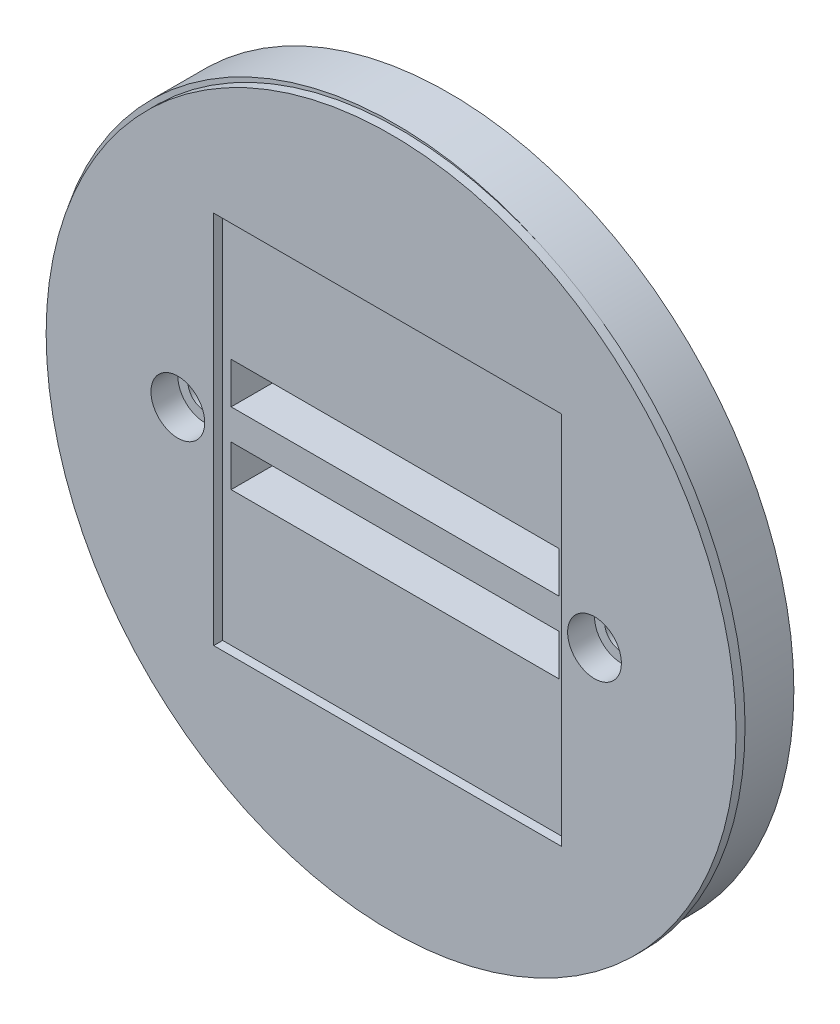
ISO-10303-21;
HEADER;
FILE_DESCRIPTION(('STEP AP214'),'2;1');
FILE_NAME('part.step','',(''),(''),'','','');
FILE_SCHEMA(('AUTOMOTIVE_DESIGN { 1 0 10303 214 1 1 1 1 }'));
ENDSEC;
DATA;
#1=APPLICATION_CONTEXT('core data for automotive mechanical design processes');
#2=APPLICATION_PROTOCOL_DEFINITION('international standard','automotive_design',2000,#1);
#3=PRODUCT_CONTEXT('',#1,'mechanical');
#4=PRODUCT('Part','Part','',(#3));
#5=PRODUCT_RELATED_PRODUCT_CATEGORY('part','',(#4));
#6=PRODUCT_DEFINITION_FORMATION('','',#4);
#7=PRODUCT_DEFINITION_CONTEXT('part definition',#1,'design');
#8=PRODUCT_DEFINITION('design','',#6,#7);
#9=PRODUCT_DEFINITION_SHAPE('','',#8);
#10=(LENGTH_UNIT() NAMED_UNIT(*) SI_UNIT(.MILLI.,.METRE.));
#11=(NAMED_UNIT(*) PLANE_ANGLE_UNIT() SI_UNIT($,.RADIAN.));
#12=(NAMED_UNIT(*) SI_UNIT($,.STERADIAN.) SOLID_ANGLE_UNIT());
#13=UNCERTAINTY_MEASURE_WITH_UNIT(LENGTH_MEASURE(1.E-05),#10,'distance_accuracy_value','');
#14=(GEOMETRIC_REPRESENTATION_CONTEXT(3) GLOBAL_UNCERTAINTY_ASSIGNED_CONTEXT((#13)) GLOBAL_UNIT_ASSIGNED_CONTEXT((#10,
#11,#12)) REPRESENTATION_CONTEXT('',''));
#15=CARTESIAN_POINT('',(0.,0.,0.));
#16=DIRECTION('',(0.,0.,1.));
#17=DIRECTION('',(1.,0.,0.));
#18=AXIS2_PLACEMENT_3D('',#15,#16,#17);
#19=CARTESIAN_POINT('',(23.25,0.,-6.));
#20=DIRECTION('',(0.,0.,1.));
#21=DIRECTION('',(1.,0.,0.));
#22=AXIS2_PLACEMENT_3D('',#19,#20,#21);
#23=CYLINDRICAL_SURFACE('',#22,1.875);
#24=CARTESIAN_POINT('',(23.25,0.,-6.));
#25=DIRECTION('',(0.,0.,1.));
#26=DIRECTION('',(-1.,0.,0.));
#27=AXIS2_PLACEMENT_3D('',#24,#25,#26);
#28=CIRCLE('',#27,1.875);
#29=CARTESIAN_POINT('',(21.375,0.,-6.));
#30=VERTEX_POINT('',#29);
#31=EDGE_CURVE('E175',#30,#30,#28,.T.);
#32=ORIENTED_EDGE('',*,*,#31,.F.);
#33=EDGE_LOOP('',(#32));
#34=FACE_BOUND('',#33,.T.);
#35=CARTESIAN_POINT('',(23.25,0.,-2.));
#36=DIRECTION('',(0.,0.,1.));
#37=DIRECTION('',(1.,0.,0.));
#38=AXIS2_PLACEMENT_3D('',#35,#36,#37);
#39=CIRCLE('',#38,1.875);
#40=CARTESIAN_POINT('',(25.125,0.,-2.));
#41=VERTEX_POINT('',#40);
#42=EDGE_CURVE('E36',#41,#41,#39,.F.);
#43=ORIENTED_EDGE('',*,*,#42,.F.);
#44=EDGE_LOOP('',(#43));
#45=FACE_BOUND('',#44,.T.);
#46=ADVANCED_FACE('F32',(#34,#45),#23,.F.);
#47=CARTESIAN_POINT('',(-23.25,0.,-6.));
#48=DIRECTION('',(0.,0.,1.));
#49=DIRECTION('',(1.,0.,0.));
#50=AXIS2_PLACEMENT_3D('',#47,#48,#49);
#51=CYLINDRICAL_SURFACE('',#50,1.875);
#52=CARTESIAN_POINT('',(-23.25,0.,-6.));
#53=DIRECTION('',(0.,0.,1.));
#54=DIRECTION('',(1.,0.,0.));
#55=AXIS2_PLACEMENT_3D('',#52,#53,#54);
#56=CIRCLE('',#55,1.875);
#57=CARTESIAN_POINT('',(-21.375,0.,-6.));
#58=VERTEX_POINT('',#57);
#59=EDGE_CURVE('E205',#58,#58,#56,.T.);
#60=ORIENTED_EDGE('',*,*,#59,.F.);
#61=EDGE_LOOP('',(#60));
#62=FACE_BOUND('',#61,.T.);
#63=CARTESIAN_POINT('',(-23.25,0.,-2.));
#64=DIRECTION('',(0.,0.,1.));
#65=DIRECTION('',(1.,0.,0.));
#66=AXIS2_PLACEMENT_3D('',#63,#64,#65);
#67=CIRCLE('',#66,1.875);
#68=CARTESIAN_POINT('',(-21.375,0.,-2.));
#69=VERTEX_POINT('',#68);
#70=EDGE_CURVE('E161',#69,#69,#67,.F.);
#71=ORIENTED_EDGE('',*,*,#70,.F.);
#72=EDGE_LOOP('',(#71));
#73=FACE_BOUND('',#72,.T.);
#74=ADVANCED_FACE('F271',(#62,#73),#51,.F.);
#75=CARTESIAN_POINT('',(0.,0.,0.));
#76=DIRECTION('',(0.,0.,1.));
#77=DIRECTION('',(1.,0.,0.));
#78=AXIS2_PLACEMENT_3D('',#75,#76,#77);
#79=PLANE('',#78);
#80=DIRECTION('',(-1.,0.,0.));
#81=VECTOR('',#80,1.);
#82=CARTESIAN_POINT('',(-18.3,6.59999999999948,0.));
#83=LINE('',#82,#81);
#84=CARTESIAN_POINT('',(18.3,6.59999999999948,0.));
#85=VERTEX_POINT('',#84);
#86=CARTESIAN_POINT('',(-18.3,6.59999999999948,0.));
#87=VERTEX_POINT('',#86);
#88=EDGE_CURVE('E214',#85,#87,#83,.T.);
#89=ORIENTED_EDGE('',*,*,#88,.F.);
#90=DIRECTION('',(0.,1.,0.));
#91=VECTOR('',#90,1.);
#92=CARTESIAN_POINT('',(18.3,6.59999999999948,0.));
#93=LINE('',#92,#91);
#94=CARTESIAN_POINT('',(18.3,1.99999999999948,0.));
#95=VERTEX_POINT('',#94);
#96=EDGE_CURVE('E219',#95,#85,#93,.T.);
#97=ORIENTED_EDGE('',*,*,#96,.F.);
#98=DIRECTION('',(1.,0.,0.));
#99=VECTOR('',#98,1.);
#100=CARTESIAN_POINT('',(18.3,1.99999999999948,0.));
#101=LINE('',#100,#99);
#102=CARTESIAN_POINT('',(-18.3,1.99999999999948,0.));
#103=VERTEX_POINT('',#102);
#104=EDGE_CURVE('E233',#103,#95,#101,.T.);
#105=ORIENTED_EDGE('',*,*,#104,.F.);
#106=DIRECTION('',(0.,-1.,0.));
#107=VECTOR('',#106,1.);
#108=CARTESIAN_POINT('',(-18.3,1.99999999999948,0.));
#109=LINE('',#108,#107);
#110=EDGE_CURVE('E230',#87,#103,#109,.T.);
#111=ORIENTED_EDGE('',*,*,#110,.F.);
#112=EDGE_LOOP('',(#89,#97,#105,#111));
#113=FACE_BOUND('',#112,.T.);
#114=DIRECTION('',(0.,1.,0.));
#115=VECTOR('',#114,1.);
#116=CARTESIAN_POINT('',(18.3,-6.00000000000038,0.));
#117=LINE('',#116,#115);
#118=CARTESIAN_POINT('',(18.3,-6.00000000000038,0.));
#119=VERTEX_POINT('',#118);
#120=CARTESIAN_POINT('',(18.3,-1.40000000000038,0.));
#121=VERTEX_POINT('',#120);
#122=EDGE_CURVE('E179',#119,#121,#117,.T.);
#123=ORIENTED_EDGE('',*,*,#122,.F.);
#124=DIRECTION('',(1.,0.,0.));
#125=VECTOR('',#124,1.);
#126=CARTESIAN_POINT('',(-18.3,-6.00000000000038,0.));
#127=LINE('',#126,#125);
#128=CARTESIAN_POINT('',(-18.3,-6.00000000000038,0.));
#129=VERTEX_POINT('',#128);
#130=EDGE_CURVE('E184',#129,#119,#127,.T.);
#131=ORIENTED_EDGE('',*,*,#130,.F.);
#132=DIRECTION('',(0.,-1.,0.));
#133=VECTOR('',#132,1.);
#134=CARTESIAN_POINT('',(-18.3,-1.40000000000038,0.));
#135=LINE('',#134,#133);
#136=CARTESIAN_POINT('',(-18.3,-1.40000000000038,0.));
#137=VERTEX_POINT('',#136);
#138=EDGE_CURVE('E198',#137,#129,#135,.T.);
#139=ORIENTED_EDGE('',*,*,#138,.F.);
#140=DIRECTION('',(-1.,0.,0.));
#141=VECTOR('',#140,1.);
#142=CARTESIAN_POINT('',(18.3,-1.40000000000038,0.));
#143=LINE('',#142,#141);
#144=EDGE_CURVE('E195',#121,#137,#143,.T.);
#145=ORIENTED_EDGE('',*,*,#144,.F.);
#146=EDGE_LOOP('',(#123,#131,#139,#145));
#147=FACE_BOUND('',#146,.T.);
#148=DIRECTION('',(1.,0.,0.));
#149=VECTOR('',#148,1.);
#150=CARTESIAN_POINT('',(-19.25,-21.05,0.));
#151=LINE('',#150,#149);
#152=CARTESIAN_POINT('',(-19.25,-21.05,0.));
#153=VERTEX_POINT('',#152);
#154=CARTESIAN_POINT('',(19.55,-21.05,0.));
#155=VERTEX_POINT('',#154);
#156=EDGE_CURVE('E139',#153,#155,#151,.T.);
#157=ORIENTED_EDGE('',*,*,#156,.T.);
#158=DIRECTION('',(0.,1.,0.));
#159=VECTOR('',#158,1.);
#160=CARTESIAN_POINT('',(19.55,20.75,0.));
#161=LINE('',#160,#159);
#162=CARTESIAN_POINT('',(19.55,20.75,0.));
#163=VERTEX_POINT('',#162);
#164=EDGE_CURVE('E159',#155,#163,#161,.T.);
#165=ORIENTED_EDGE('',*,*,#164,.T.);
#166=DIRECTION('',(-1.,0.,0.));
#167=VECTOR('',#166,1.);
#168=CARTESIAN_POINT('',(-19.25,20.75,0.));
#169=LINE('',#168,#167);
#170=CARTESIAN_POINT('',(-19.25,20.75,0.));
#171=VERTEX_POINT('',#170);
#172=EDGE_CURVE('E145',#163,#171,#169,.T.);
#173=ORIENTED_EDGE('',*,*,#172,.T.);
#174=DIRECTION('',(0.,-1.,0.));
#175=VECTOR('',#174,1.);
#176=CARTESIAN_POINT('',(-19.25,20.75,0.));
#177=LINE('',#176,#175);
#178=EDGE_CURVE('E163',#171,#153,#177,.T.);
#179=ORIENTED_EDGE('',*,*,#178,.T.);
#180=EDGE_LOOP('',(#157,#165,#173,#179));
#181=FACE_BOUND('',#180,.T.);
#182=ADVANCED_FACE('F277',(#113,#147,#181),#79,.T.);
#183=CARTESIAN_POINT('',(0.,0.,-6.));
#184=DIRECTION('',(0.,0.,1.));
#185=DIRECTION('',(1.,0.,0.));
#186=AXIS2_PLACEMENT_3D('',#183,#184,#185);
#187=CYLINDRICAL_SURFACE('',#186,38.5);
#188=CARTESIAN_POINT('',(0.,0.,-6.));
#189=DIRECTION('',(0.,0.,1.));
#190=DIRECTION('',(1.,0.,0.));
#191=AXIS2_PLACEMENT_3D('',#188,#189,#190);
#192=CIRCLE('',#191,38.5);
#193=CARTESIAN_POINT('',(38.5,0.,-6.));
#194=VERTEX_POINT('',#193);
#195=EDGE_CURVE('E11',#194,#194,#192,.T.);
#196=ORIENTED_EDGE('',*,*,#195,.T.);
#197=EDGE_LOOP('',(#196));
#198=FACE_BOUND('',#197,.T.);
#199=CARTESIAN_POINT('',(0.,0.,0.));
#200=DIRECTION('',(0.,0.,1.));
#201=DIRECTION('',(1.,0.,0.));
#202=AXIS2_PLACEMENT_3D('',#199,#200,#201);
#203=CIRCLE('',#202,38.5);
#204=CARTESIAN_POINT('',(16.2059229646879,34.9230305223158,0.));
#205=VERTEX_POINT('',#204);
#206=CARTESIAN_POINT('',(-15.6559229646895,-35.173030522315,0.));
#207=VERTEX_POINT('',#206);
#208=EDGE_CURVE('E41',#205,#207,#203,.T.);
#209=ORIENTED_EDGE('',*,*,#208,.F.);
#210=EDGE_CURVE('E240',#207,#205,#203,.T.);
#211=ORIENTED_EDGE('',*,*,#210,.F.);
#212=EDGE_LOOP('',(#209,#211));
#213=FACE_BOUND('',#212,.T.);
#214=ADVANCED_FACE('F34',(#198,#213),#187,.T.);
#215=CARTESIAN_POINT('',(0.,0.,-6.));
#216=DIRECTION('',(0.,0.,1.));
#217=DIRECTION('',(1.,0.,0.));
#218=AXIS2_PLACEMENT_3D('',#215,#216,#217);
#219=PLANE('',#218);
#220=ORIENTED_EDGE('',*,*,#31,.T.);
#221=EDGE_LOOP('',(#220));
#222=FACE_BOUND('',#221,.T.);
#223=DIRECTION('',(1.,0.,0.));
#224=VECTOR('',#223,1.);
#225=CARTESIAN_POINT('',(-18.3,-6.00000000000038,-6.));
#226=LINE('',#225,#224);
#227=CARTESIAN_POINT('',(-18.3,-6.00000000000038,-6.));
#228=VERTEX_POINT('',#227);
#229=CARTESIAN_POINT('',(18.3,-6.00000000000038,-6.));
#230=VERTEX_POINT('',#229);
#231=EDGE_CURVE('E190',#228,#230,#226,.T.);
#232=ORIENTED_EDGE('',*,*,#231,.T.);
#233=DIRECTION('',(0.,1.,0.));
#234=VECTOR('',#233,1.);
#235=CARTESIAN_POINT('',(18.3,-6.00000000000038,-6.));
#236=LINE('',#235,#234);
#237=CARTESIAN_POINT('',(18.3,-1.40000000000038,-6.));
#238=VERTEX_POINT('',#237);
#239=EDGE_CURVE('E180',#230,#238,#236,.T.);
#240=ORIENTED_EDGE('',*,*,#239,.T.);
#241=DIRECTION('',(-1.,0.,0.));
#242=VECTOR('',#241,1.);
#243=CARTESIAN_POINT('',(18.3,-1.40000000000038,-6.));
#244=LINE('',#243,#242);
#245=CARTESIAN_POINT('',(-18.3,-1.40000000000038,-6.));
#246=VERTEX_POINT('',#245);
#247=EDGE_CURVE('E183',#238,#246,#244,.T.);
#248=ORIENTED_EDGE('',*,*,#247,.T.);
#249=DIRECTION('',(0.,-1.,0.));
#250=VECTOR('',#249,1.);
#251=CARTESIAN_POINT('',(-18.3,-1.40000000000038,-6.));
#252=LINE('',#251,#250);
#253=EDGE_CURVE('E187',#246,#228,#252,.T.);
#254=ORIENTED_EDGE('',*,*,#253,.T.);
#255=EDGE_LOOP('',(#232,#240,#248,#254));
#256=FACE_BOUND('',#255,.T.);
#257=ORIENTED_EDGE('',*,*,#59,.T.);
#258=EDGE_LOOP('',(#257));
#259=FACE_BOUND('',#258,.T.);
#260=DIRECTION('',(0.,1.,0.));
#261=VECTOR('',#260,1.);
#262=CARTESIAN_POINT('',(18.3,6.59999999999948,-6.));
#263=LINE('',#262,#261);
#264=CARTESIAN_POINT('',(18.3,1.99999999999948,-6.));
#265=VERTEX_POINT('',#264);
#266=CARTESIAN_POINT('',(18.3,6.59999999999948,-6.));
#267=VERTEX_POINT('',#266);
#268=EDGE_CURVE('E225',#265,#267,#263,.T.);
#269=ORIENTED_EDGE('',*,*,#268,.T.);
#270=DIRECTION('',(-1.,0.,0.));
#271=VECTOR('',#270,1.);
#272=CARTESIAN_POINT('',(-18.3,6.59999999999948,-6.));
#273=LINE('',#272,#271);
#274=CARTESIAN_POINT('',(-18.3,6.59999999999948,-6.));
#275=VERTEX_POINT('',#274);
#276=EDGE_CURVE('E215',#267,#275,#273,.T.);
#277=ORIENTED_EDGE('',*,*,#276,.T.);
#278=DIRECTION('',(0.,-1.,0.));
#279=VECTOR('',#278,1.);
#280=CARTESIAN_POINT('',(-18.3,1.99999999999948,-6.));
#281=LINE('',#280,#279);
#282=CARTESIAN_POINT('',(-18.3,1.99999999999948,-6.));
#283=VERTEX_POINT('',#282);
#284=EDGE_CURVE('E218',#275,#283,#281,.T.);
#285=ORIENTED_EDGE('',*,*,#284,.T.);
#286=DIRECTION('',(1.,0.,0.));
#287=VECTOR('',#286,1.);
#288=CARTESIAN_POINT('',(18.3,1.99999999999948,-6.));
#289=LINE('',#288,#287);
#290=EDGE_CURVE('E222',#283,#265,#289,.T.);
#291=ORIENTED_EDGE('',*,*,#290,.T.);
#292=EDGE_LOOP('',(#269,#277,#285,#291));
#293=FACE_BOUND('',#292,.T.);
#294=ORIENTED_EDGE('',*,*,#195,.F.);
#295=EDGE_LOOP('',(#294));
#296=FACE_BOUND('',#295,.T.);
#297=ADVANCED_FACE('F319',(#222,#256,#259,#293,#296),#219,.F.);
#298=CARTESIAN_POINT('',(0.549999999999996,-0.249999999999997,0.));
#299=DIRECTION('',(0.,0.,1.));
#300=DIRECTION('',(1.,0.,0.));
#301=AXIS2_PLACEMENT_3D('',#298,#299,#300);
#302=CIRCLE('',#301,38.5);
#303=EDGE_CURVE('E56',#205,#207,#302,.T.);
#304=ORIENTED_EDGE('',*,*,#303,.F.);
#305=ORIENTED_EDGE('',*,*,#208,.T.);
#306=EDGE_LOOP('',(#304,#305));
#307=FACE_BOUND('',#306,.T.);
#308=ADVANCED_FACE('F317',(#307),#79,.T.);
#309=CARTESIAN_POINT('',(-18.3,6.59999999999948,-6.));
#310=DIRECTION('',(0.,1.,0.));
#311=DIRECTION('',(0.,0.,1.));
#312=AXIS2_PLACEMENT_3D('',#309,#310,#311);
#313=PLANE('',#312);
#314=ORIENTED_EDGE('',*,*,#88,.T.);
#315=DIRECTION('',(0.,0.,1.));
#316=VECTOR('',#315,1.);
#317=CARTESIAN_POINT('',(-18.3,6.59999999999948,-6.));
#318=LINE('',#317,#316);
#319=EDGE_CURVE('E228',#275,#87,#318,.T.);
#320=ORIENTED_EDGE('',*,*,#319,.F.);
#321=ORIENTED_EDGE('',*,*,#276,.F.);
#322=DIRECTION('',(0.,0.,1.));
#323=VECTOR('',#322,1.);
#324=CARTESIAN_POINT('',(18.3,6.59999999999948,-6.));
#325=LINE('',#324,#323);
#326=EDGE_CURVE('E238',#267,#85,#325,.T.);
#327=ORIENTED_EDGE('',*,*,#326,.T.);
#328=EDGE_LOOP('',(#314,#320,#321,#327));
#329=FACE_BOUND('',#328,.T.);
#330=ADVANCED_FACE('F307',(#329),#313,.F.);
#331=CARTESIAN_POINT('',(18.3,6.59999999999948,-6.));
#332=DIRECTION('',(1.,0.,0.));
#333=DIRECTION('',(0.,0.,-1.));
#334=AXIS2_PLACEMENT_3D('',#331,#332,#333);
#335=PLANE('',#334);
#336=ORIENTED_EDGE('',*,*,#96,.T.);
#337=ORIENTED_EDGE('',*,*,#326,.F.);
#338=ORIENTED_EDGE('',*,*,#268,.F.);
#339=DIRECTION('',(0.,0.,1.));
#340=VECTOR('',#339,1.);
#341=CARTESIAN_POINT('',(18.3,1.99999999999948,-6.));
#342=LINE('',#341,#340);
#343=EDGE_CURVE('E241',#265,#95,#342,.T.);
#344=ORIENTED_EDGE('',*,*,#343,.T.);
#345=EDGE_LOOP('',(#336,#337,#338,#344));
#346=FACE_BOUND('',#345,.T.);
#347=ADVANCED_FACE('F303',(#346),#335,.F.);
#348=CARTESIAN_POINT('',(18.3,1.99999999999948,-6.));
#349=DIRECTION('',(0.,-1.,0.));
#350=DIRECTION('',(1.,0.,0.));
#351=AXIS2_PLACEMENT_3D('',#348,#349,#350);
#352=PLANE('',#351);
#353=ORIENTED_EDGE('',*,*,#104,.T.);
#354=ORIENTED_EDGE('',*,*,#343,.F.);
#355=ORIENTED_EDGE('',*,*,#290,.F.);
#356=DIRECTION('',(0.,0.,1.));
#357=VECTOR('',#356,1.);
#358=CARTESIAN_POINT('',(-18.3,1.99999999999948,-6.));
#359=LINE('',#358,#357);
#360=EDGE_CURVE('E243',#283,#103,#359,.T.);
#361=ORIENTED_EDGE('',*,*,#360,.T.);
#362=EDGE_LOOP('',(#353,#354,#355,#361));
#363=FACE_BOUND('',#362,.T.);
#364=ADVANCED_FACE('F306',(#363),#352,.F.);
#365=CARTESIAN_POINT('',(-18.3,1.99999999999948,-6.));
#366=DIRECTION('',(-1.,0.,0.));
#367=DIRECTION('',(0.,0.,1.));
#368=AXIS2_PLACEMENT_3D('',#365,#366,#367);
#369=PLANE('',#368);
#370=ORIENTED_EDGE('',*,*,#110,.T.);
#371=ORIENTED_EDGE('',*,*,#360,.F.);
#372=ORIENTED_EDGE('',*,*,#284,.F.);
#373=ORIENTED_EDGE('',*,*,#319,.T.);
#374=EDGE_LOOP('',(#370,#371,#372,#373));
#375=FACE_BOUND('',#374,.T.);
#376=ADVANCED_FACE('F300',(#375),#369,.F.);
#377=CARTESIAN_POINT('',(18.3,-6.00000000000038,-6.));
#378=DIRECTION('',(1.,0.,0.));
#379=DIRECTION('',(0.,0.,-1.));
#380=AXIS2_PLACEMENT_3D('',#377,#378,#379);
#381=PLANE('',#380);
#382=ORIENTED_EDGE('',*,*,#122,.T.);
#383=DIRECTION('',(0.,0.,1.));
#384=VECTOR('',#383,1.);
#385=CARTESIAN_POINT('',(18.3,-1.40000000000038,-6.));
#386=LINE('',#385,#384);
#387=EDGE_CURVE('E193',#238,#121,#386,.T.);
#388=ORIENTED_EDGE('',*,*,#387,.F.);
#389=ORIENTED_EDGE('',*,*,#239,.F.);
#390=DIRECTION('',(0.,0.,1.));
#391=VECTOR('',#390,1.);
#392=CARTESIAN_POINT('',(18.3,-6.00000000000038,-6.));
#393=LINE('',#392,#391);
#394=EDGE_CURVE('E203',#230,#119,#393,.T.);
#395=ORIENTED_EDGE('',*,*,#394,.T.);
#396=EDGE_LOOP('',(#382,#388,#389,#395));
#397=FACE_BOUND('',#396,.T.);
#398=ADVANCED_FACE('F289',(#397),#381,.F.);
#399=CARTESIAN_POINT('',(-18.3,-6.00000000000038,-6.));
#400=DIRECTION('',(0.,-1.,0.));
#401=DIRECTION('',(0.,0.,-1.));
#402=AXIS2_PLACEMENT_3D('',#399,#400,#401);
#403=PLANE('',#402);
#404=ORIENTED_EDGE('',*,*,#130,.T.);
#405=ORIENTED_EDGE('',*,*,#394,.F.);
#406=ORIENTED_EDGE('',*,*,#231,.F.);
#407=DIRECTION('',(0.,0.,1.));
#408=VECTOR('',#407,1.);
#409=CARTESIAN_POINT('',(-18.3,-6.00000000000038,-6.));
#410=LINE('',#409,#408);
#411=EDGE_CURVE('E206',#228,#129,#410,.T.);
#412=ORIENTED_EDGE('',*,*,#411,.T.);
#413=EDGE_LOOP('',(#404,#405,#406,#412));
#414=FACE_BOUND('',#413,.T.);
#415=ADVANCED_FACE('F285',(#414),#403,.F.);
#416=CARTESIAN_POINT('',(-18.3,-1.40000000000038,-6.));
#417=DIRECTION('',(-1.,0.,0.));
#418=DIRECTION('',(0.,0.,1.));
#419=AXIS2_PLACEMENT_3D('',#416,#417,#418);
#420=PLANE('',#419);
#421=ORIENTED_EDGE('',*,*,#138,.T.);
#422=ORIENTED_EDGE('',*,*,#411,.F.);
#423=ORIENTED_EDGE('',*,*,#253,.F.);
#424=DIRECTION('',(0.,0.,1.));
#425=VECTOR('',#424,1.);
#426=CARTESIAN_POINT('',(-18.3,-1.40000000000038,-6.));
#427=LINE('',#426,#425);
#428=EDGE_CURVE('E208',#246,#137,#427,.T.);
#429=ORIENTED_EDGE('',*,*,#428,.T.);
#430=EDGE_LOOP('',(#421,#422,#423,#429));
#431=FACE_BOUND('',#430,.T.);
#432=ADVANCED_FACE('F288',(#431),#420,.F.);
#433=CARTESIAN_POINT('',(18.3,-1.40000000000038,-6.));
#434=DIRECTION('',(0.,1.,0.));
#435=DIRECTION('',(-1.,0.,0.));
#436=AXIS2_PLACEMENT_3D('',#433,#434,#435);
#437=PLANE('',#436);
#438=ORIENTED_EDGE('',*,*,#144,.T.);
#439=ORIENTED_EDGE('',*,*,#428,.F.);
#440=ORIENTED_EDGE('',*,*,#247,.F.);
#441=ORIENTED_EDGE('',*,*,#387,.T.);
#442=EDGE_LOOP('',(#438,#439,#440,#441));
#443=FACE_BOUND('',#442,.T.);
#444=ADVANCED_FACE('F293',(#443),#437,.F.);
#445=CARTESIAN_POINT('',(0.549999999999996,-0.249999999999997,0.));
#446=DIRECTION('',(0.,0.,1.));
#447=DIRECTION('',(1.,0.,0.));
#448=AXIS2_PLACEMENT_3D('',#445,#446,#447);
#449=PLANE('',#448);
#450=EDGE_CURVE('E146',#207,#205,#302,.T.);
#451=ORIENTED_EDGE('',*,*,#450,.F.);
#452=ORIENTED_EDGE('',*,*,#210,.T.);
#453=EDGE_LOOP('',(#451,#452));
#454=FACE_BOUND('',#453,.T.);
#455=ADVANCED_FACE('F297',(#454),#449,.F.);
#456=CARTESIAN_POINT('',(0.549999999999996,-0.249999999999997,1.));
#457=DIRECTION('',(0.,0.,1.));
#458=DIRECTION('',(1.,0.,0.));
#459=AXIS2_PLACEMENT_3D('',#456,#457,#458);
#460=PLANE('',#459);
#461=CARTESIAN_POINT('',(23.25,0.,1.));
#462=DIRECTION('',(0.,0.,1.));
#463=DIRECTION('',(1.,0.,0.));
#464=AXIS2_PLACEMENT_3D('',#461,#462,#463);
#465=CIRCLE('',#464,3.);
#466=CARTESIAN_POINT('',(26.25,0.,1.));
#467=VERTEX_POINT('',#466);
#468=EDGE_CURVE('E258',#467,#467,#465,.T.);
#469=ORIENTED_EDGE('',*,*,#468,.F.);
#470=EDGE_LOOP('',(#469));
#471=FACE_BOUND('',#470,.T.);
#472=CARTESIAN_POINT('',(-23.25,0.,1.));
#473=DIRECTION('',(0.,0.,1.));
#474=DIRECTION('',(1.,0.,0.));
#475=AXIS2_PLACEMENT_3D('',#472,#473,#474);
#476=CIRCLE('',#475,3.);
#477=CARTESIAN_POINT('',(-20.25,0.,1.));
#478=VERTEX_POINT('',#477);
#479=EDGE_CURVE('E252',#478,#478,#476,.T.);
#480=ORIENTED_EDGE('',*,*,#479,.F.);
#481=EDGE_LOOP('',(#480));
#482=FACE_BOUND('',#481,.T.);
#483=CARTESIAN_POINT('',(0.549999999999996,-0.249999999999997,1.));
#484=DIRECTION('',(0.,0.,1.));
#485=DIRECTION('',(1.,0.,0.));
#486=AXIS2_PLACEMENT_3D('',#483,#484,#485);
#487=CIRCLE('',#486,38.5);
#488=CARTESIAN_POINT('',(39.05,-0.249999999999997,1.));
#489=VERTEX_POINT('',#488);
#490=EDGE_CURVE('E172',#489,#489,#487,.T.);
#491=ORIENTED_EDGE('',*,*,#490,.T.);
#492=EDGE_LOOP('',(#491));
#493=FACE_BOUND('',#492,.T.);
#494=DIRECTION('',(-1.,0.,0.));
#495=VECTOR('',#494,1.);
#496=CARTESIAN_POINT('',(-19.25,20.75,1.));
#497=LINE('',#496,#495);
#498=CARTESIAN_POINT('',(19.55,20.75,1.));
#499=VERTEX_POINT('',#498);
#500=CARTESIAN_POINT('',(-19.25,20.75,1.));
#501=VERTEX_POINT('',#500);
#502=EDGE_CURVE('E138',#499,#501,#497,.T.);
#503=ORIENTED_EDGE('',*,*,#502,.F.);
#504=DIRECTION('',(0.,1.,0.));
#505=VECTOR('',#504,1.);
#506=CARTESIAN_POINT('',(19.55,20.75,1.));
#507=LINE('',#506,#505);
#508=CARTESIAN_POINT('',(19.55,-21.05,1.));
#509=VERTEX_POINT('',#508);
#510=EDGE_CURVE('E130',#509,#499,#507,.T.);
#511=ORIENTED_EDGE('',*,*,#510,.F.);
#512=DIRECTION('',(1.,0.,0.));
#513=VECTOR('',#512,1.);
#514=CARTESIAN_POINT('',(-19.25,-21.05,1.));
#515=LINE('',#514,#513);
#516=CARTESIAN_POINT('',(-19.25,-21.05,1.));
#517=VERTEX_POINT('',#516);
#518=EDGE_CURVE('E154',#517,#509,#515,.T.);
#519=ORIENTED_EDGE('',*,*,#518,.F.);
#520=DIRECTION('',(0.,-1.,0.));
#521=VECTOR('',#520,1.);
#522=CARTESIAN_POINT('',(-19.25,20.75,1.));
#523=LINE('',#522,#521);
#524=EDGE_CURVE('E152',#501,#517,#523,.T.);
#525=ORIENTED_EDGE('',*,*,#524,.F.);
#526=EDGE_LOOP('',(#503,#511,#519,#525));
#527=FACE_BOUND('',#526,.T.);
#528=ADVANCED_FACE('F150',(#471,#482,#493,#527),#460,.T.);
#529=CARTESIAN_POINT('',(0.549999999999996,-0.249999999999997,1.));
#530=DIRECTION('',(0.,0.,-1.));
#531=DIRECTION('',(-1.,0.,0.));
#532=AXIS2_PLACEMENT_3D('',#529,#530,#531);
#533=CYLINDRICAL_SURFACE('',#532,38.5);
#534=ORIENTED_EDGE('',*,*,#490,.F.);
#535=EDGE_LOOP('',(#534));
#536=FACE_BOUND('',#535,.T.);
#537=ORIENTED_EDGE('',*,*,#303,.T.);
#538=ORIENTED_EDGE('',*,*,#450,.T.);
#539=EDGE_LOOP('',(#537,#538));
#540=FACE_BOUND('',#539,.T.);
#541=ADVANCED_FACE('F283',(#536,#540),#533,.T.);
#542=CARTESIAN_POINT('',(19.55,20.75,1.));
#543=DIRECTION('',(-1.,0.,0.));
#544=DIRECTION('',(0.,-1.,0.));
#545=AXIS2_PLACEMENT_3D('',#542,#543,#544);
#546=PLANE('',#545);
#547=ORIENTED_EDGE('',*,*,#164,.F.);
#548=DIRECTION('',(0.,0.,-1.));
#549=VECTOR('',#548,1.);
#550=CARTESIAN_POINT('',(19.55,-21.05,1.));
#551=LINE('',#550,#549);
#552=EDGE_CURVE('E49',#509,#155,#551,.T.);
#553=ORIENTED_EDGE('',*,*,#552,.F.);
#554=ORIENTED_EDGE('',*,*,#510,.T.);
#555=DIRECTION('',(0.,0.,-1.));
#556=VECTOR('',#555,1.);
#557=CARTESIAN_POINT('',(19.55,20.75,1.));
#558=LINE('',#557,#556);
#559=EDGE_CURVE('E133',#499,#163,#558,.T.);
#560=ORIENTED_EDGE('',*,*,#559,.T.);
#561=EDGE_LOOP('',(#547,#553,#554,#560));
#562=FACE_BOUND('',#561,.T.);
#563=ADVANCED_FACE('F132',(#562),#546,.T.);
#564=CARTESIAN_POINT('',(-19.25,20.75,1.));
#565=DIRECTION('',(0.,-1.,0.));
#566=DIRECTION('',(0.,0.,-1.));
#567=AXIS2_PLACEMENT_3D('',#564,#565,#566);
#568=PLANE('',#567);
#569=ORIENTED_EDGE('',*,*,#172,.F.);
#570=ORIENTED_EDGE('',*,*,#559,.F.);
#571=ORIENTED_EDGE('',*,*,#502,.T.);
#572=DIRECTION('',(0.,0.,-1.));
#573=VECTOR('',#572,1.);
#574=CARTESIAN_POINT('',(-19.25,20.75,1.));
#575=LINE('',#574,#573);
#576=EDGE_CURVE('E147',#501,#171,#575,.T.);
#577=ORIENTED_EDGE('',*,*,#576,.T.);
#578=EDGE_LOOP('',(#569,#570,#571,#577));
#579=FACE_BOUND('',#578,.T.);
#580=ADVANCED_FACE('F142',(#579),#568,.T.);
#581=CARTESIAN_POINT('',(-19.25,20.75,1.));
#582=DIRECTION('',(1.,0.,0.));
#583=DIRECTION('',(0.,1.,0.));
#584=AXIS2_PLACEMENT_3D('',#581,#582,#583);
#585=PLANE('',#584);
#586=ORIENTED_EDGE('',*,*,#178,.F.);
#587=ORIENTED_EDGE('',*,*,#576,.F.);
#588=ORIENTED_EDGE('',*,*,#524,.T.);
#589=DIRECTION('',(0.,0.,-1.));
#590=VECTOR('',#589,1.);
#591=CARTESIAN_POINT('',(-19.25,-21.05,1.));
#592=LINE('',#591,#590);
#593=EDGE_CURVE('E169',#517,#153,#592,.T.);
#594=ORIENTED_EDGE('',*,*,#593,.T.);
#595=EDGE_LOOP('',(#586,#587,#588,#594));
#596=FACE_BOUND('',#595,.T.);
#597=ADVANCED_FACE('F342',(#596),#585,.T.);
#598=CARTESIAN_POINT('',(-19.25,-21.05,1.));
#599=DIRECTION('',(0.,1.,0.));
#600=DIRECTION('',(0.,0.,1.));
#601=AXIS2_PLACEMENT_3D('',#598,#599,#600);
#602=PLANE('',#601);
#603=ORIENTED_EDGE('',*,*,#156,.F.);
#604=ORIENTED_EDGE('',*,*,#593,.F.);
#605=ORIENTED_EDGE('',*,*,#518,.T.);
#606=ORIENTED_EDGE('',*,*,#552,.T.);
#607=EDGE_LOOP('',(#603,#604,#605,#606));
#608=FACE_BOUND('',#607,.T.);
#609=ADVANCED_FACE('F340',(#608),#602,.T.);
#610=CARTESIAN_POINT('',(-23.25,0.,-2.));
#611=DIRECTION('',(0.,0.,1.));
#612=DIRECTION('',(1.,0.,0.));
#613=AXIS2_PLACEMENT_3D('',#610,#611,#612);
#614=PLANE('',#613);
#615=CARTESIAN_POINT('',(-23.25,0.,-2.));
#616=DIRECTION('',(0.,0.,1.));
#617=DIRECTION('',(1.,0.,0.));
#618=AXIS2_PLACEMENT_3D('',#615,#616,#617);
#619=CIRCLE('',#618,3.);
#620=CARTESIAN_POINT('',(-20.25,0.,-2.));
#621=VERTEX_POINT('',#620);
#622=EDGE_CURVE('E248',#621,#621,#619,.T.);
#623=ORIENTED_EDGE('',*,*,#622,.T.);
#624=EDGE_LOOP('',(#623));
#625=FACE_BOUND('',#624,.T.);
#626=ORIENTED_EDGE('',*,*,#70,.T.);
#627=EDGE_LOOP('',(#626));
#628=FACE_BOUND('',#627,.T.);
#629=ADVANCED_FACE('F349',(#625,#628),#614,.T.);
#630=CARTESIAN_POINT('',(-23.25,0.,-2.));
#631=DIRECTION('',(0.,0.,1.));
#632=DIRECTION('',(1.,0.,0.));
#633=AXIS2_PLACEMENT_3D('',#630,#631,#632);
#634=CYLINDRICAL_SURFACE('',#633,3.);
#635=ORIENTED_EDGE('',*,*,#622,.F.);
#636=EDGE_LOOP('',(#635));
#637=FACE_BOUND('',#636,.T.);
#638=ORIENTED_EDGE('',*,*,#479,.T.);
#639=EDGE_LOOP('',(#638));
#640=FACE_BOUND('',#639,.T.);
#641=ADVANCED_FACE('F417',(#637,#640),#634,.F.);
#642=CARTESIAN_POINT('',(23.25,0.,-2.));
#643=DIRECTION('',(0.,0.,1.));
#644=DIRECTION('',(1.,0.,0.));
#645=AXIS2_PLACEMENT_3D('',#642,#643,#644);
#646=PLANE('',#645);
#647=CARTESIAN_POINT('',(23.25,0.,-2.));
#648=DIRECTION('',(0.,0.,1.));
#649=DIRECTION('',(1.,0.,0.));
#650=AXIS2_PLACEMENT_3D('',#647,#648,#649);
#651=CIRCLE('',#650,3.);
#652=CARTESIAN_POINT('',(26.25,0.,-2.));
#653=VERTEX_POINT('',#652);
#654=EDGE_CURVE('E261',#653,#653,#651,.T.);
#655=ORIENTED_EDGE('',*,*,#654,.T.);
#656=EDGE_LOOP('',(#655));
#657=FACE_BOUND('',#656,.T.);
#658=ORIENTED_EDGE('',*,*,#42,.T.);
#659=EDGE_LOOP('',(#658));
#660=FACE_BOUND('',#659,.T.);
#661=ADVANCED_FACE('F268',(#657,#660),#646,.T.);
#662=CARTESIAN_POINT('',(23.25,0.,-2.));
#663=DIRECTION('',(0.,0.,1.));
#664=DIRECTION('',(1.,0.,0.));
#665=AXIS2_PLACEMENT_3D('',#662,#663,#664);
#666=CYLINDRICAL_SURFACE('',#665,3.);
#667=ORIENTED_EDGE('',*,*,#654,.F.);
#668=EDGE_LOOP('',(#667));
#669=FACE_BOUND('',#668,.T.);
#670=ORIENTED_EDGE('',*,*,#468,.T.);
#671=EDGE_LOOP('',(#670));
#672=FACE_BOUND('',#671,.T.);
#673=ADVANCED_FACE('F434',(#669,#672),#666,.F.);
#674=CLOSED_SHELL('',(#46,#74,#182,#214,#297,#308,#330,#347,#364,#376,#398,#415,#432,#444,#455,
#528,#541,#563,#580,#597,#609,#629,#641,#661,#673));
#675=MANIFOLD_SOLID_BREP('B2',#674);
#676=ADVANCED_BREP_SHAPE_REPRESENTATION('',(#18,#675),#14);
#677=SHAPE_DEFINITION_REPRESENTATION(#9,#676);
ENDSEC;
END-ISO-10303-21;
